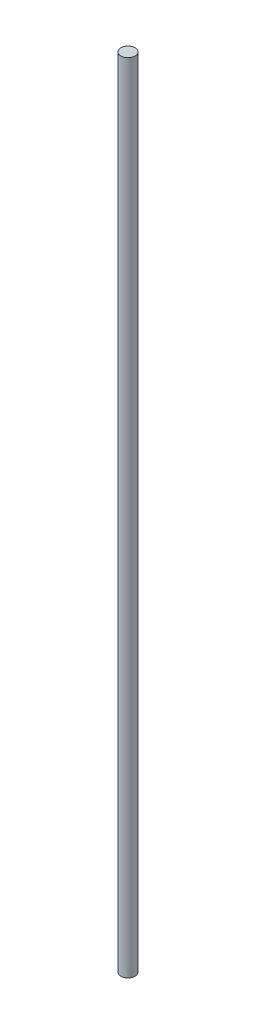
ISO-10303-21;
HEADER;
FILE_DESCRIPTION(('STEP AP214'),'2;1');
FILE_NAME('part.step','',(''),(''),'','','');
FILE_SCHEMA(('AUTOMOTIVE_DESIGN { 1 0 10303 214 1 1 1 1 }'));
ENDSEC;
DATA;
#1=APPLICATION_CONTEXT('core data for automotive mechanical design processes');
#2=APPLICATION_PROTOCOL_DEFINITION('international standard','automotive_design',2000,#1);
#3=PRODUCT_CONTEXT('',#1,'mechanical');
#4=PRODUCT('Part','Part','',(#3));
#5=PRODUCT_RELATED_PRODUCT_CATEGORY('part','',(#4));
#6=PRODUCT_DEFINITION_FORMATION('','',#4);
#7=PRODUCT_DEFINITION_CONTEXT('part definition',#1,'design');
#8=PRODUCT_DEFINITION('design','',#6,#7);
#9=PRODUCT_DEFINITION_SHAPE('','',#8);
#10=(LENGTH_UNIT() NAMED_UNIT(*) SI_UNIT(.MILLI.,.METRE.));
#11=(NAMED_UNIT(*) PLANE_ANGLE_UNIT() SI_UNIT($,.RADIAN.));
#12=(NAMED_UNIT(*) SI_UNIT($,.STERADIAN.) SOLID_ANGLE_UNIT());
#13=UNCERTAINTY_MEASURE_WITH_UNIT(LENGTH_MEASURE(1.E-05),#10,'distance_accuracy_value','');
#14=(GEOMETRIC_REPRESENTATION_CONTEXT(3) GLOBAL_UNCERTAINTY_ASSIGNED_CONTEXT((#13)) GLOBAL_UNIT_ASSIGNED_CONTEXT((#10,
#11,#12)) REPRESENTATION_CONTEXT('',''));
#15=CARTESIAN_POINT('',(0.,0.,0.));
#16=DIRECTION('',(0.,0.,1.));
#17=DIRECTION('',(1.,0.,0.));
#18=AXIS2_PLACEMENT_3D('',#15,#16,#17);
#19=CARTESIAN_POINT('',(0.,167.2,0.));
#20=DIRECTION('',(0.,-1.,0.));
#21=DIRECTION('',(0.,0.,-1.));
#22=AXIS2_PLACEMENT_3D('',#19,#20,#21);
#23=CYLINDRICAL_SURFACE('',#22,1.5);
#24=CARTESIAN_POINT('',(0.,167.2,0.));
#25=DIRECTION('',(0.,1.,0.));
#26=DIRECTION('',(0.,0.,1.));
#27=AXIS2_PLACEMENT_3D('',#24,#25,#26);
#28=CIRCLE('',#27,1.5);
#29=CARTESIAN_POINT('',(0.,167.2,1.5));
#30=VERTEX_POINT('',#29);
#31=EDGE_CURVE('E10',#30,#30,#28,.T.);
#32=ORIENTED_EDGE('',*,*,#31,.F.);
#33=EDGE_LOOP('',(#32));
#34=FACE_BOUND('',#33,.T.);
#35=CARTESIAN_POINT('',(0.,0.,0.));
#36=DIRECTION('',(0.,1.,0.));
#37=DIRECTION('',(0.,0.,1.));
#38=AXIS2_PLACEMENT_3D('',#35,#36,#37);
#39=CIRCLE('',#38,1.5);
#40=CARTESIAN_POINT('',(0.,0.,1.5));
#41=VERTEX_POINT('',#40);
#42=EDGE_CURVE('E43',#41,#41,#39,.T.);
#43=ORIENTED_EDGE('',*,*,#42,.T.);
#44=EDGE_LOOP('',(#43));
#45=FACE_BOUND('',#44,.T.);
#46=ADVANCED_FACE('F40',(#34,#45),#23,.T.);
#47=CARTESIAN_POINT('',(0.,167.2,0.));
#48=DIRECTION('',(0.,1.,0.));
#49=DIRECTION('',(0.,0.,1.));
#50=AXIS2_PLACEMENT_3D('',#47,#48,#49);
#51=PLANE('',#50);
#52=ORIENTED_EDGE('',*,*,#31,.T.);
#53=EDGE_LOOP('',(#52));
#54=FACE_BOUND('',#53,.T.);
#55=ADVANCED_FACE('F55',(#54),#51,.T.);
#56=CARTESIAN_POINT('',(0.,0.,0.));
#57=DIRECTION('',(0.,1.,0.));
#58=DIRECTION('',(0.,0.,1.));
#59=AXIS2_PLACEMENT_3D('',#56,#57,#58);
#60=PLANE('',#59);
#61=ORIENTED_EDGE('',*,*,#42,.F.);
#62=EDGE_LOOP('',(#61));
#63=FACE_BOUND('',#62,.T.);
#64=ADVANCED_FACE('F53',(#63),#60,.F.);
#65=CLOSED_SHELL('',(#46,#55,#64));
#66=MANIFOLD_SOLID_BREP('B2',#65);
#67=ADVANCED_BREP_SHAPE_REPRESENTATION('',(#18,#66),#14);
#68=SHAPE_DEFINITION_REPRESENTATION(#9,#67);
ENDSEC;
END-ISO-10303-21;
